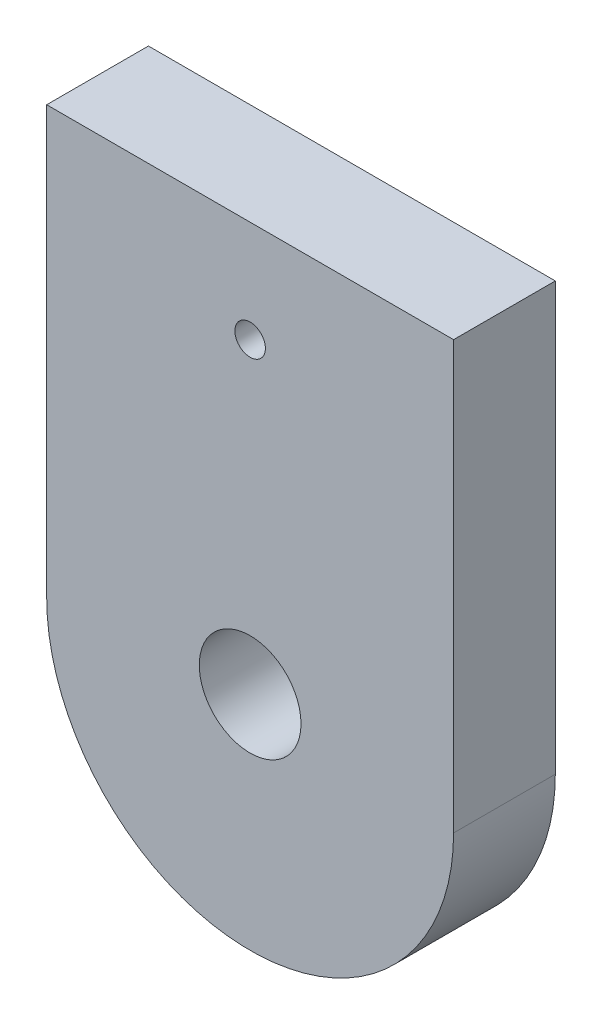
ISO-10303-21;
HEADER;
FILE_DESCRIPTION(('STEP AP214'),'2;1');
FILE_NAME('part.step','',(''),(''),'','','');
FILE_SCHEMA(('AUTOMOTIVE_DESIGN { 1 0 10303 214 1 1 1 1 }'));
ENDSEC;
DATA;
#1=APPLICATION_CONTEXT('core data for automotive mechanical design processes');
#2=APPLICATION_PROTOCOL_DEFINITION('international standard','automotive_design',2000,#1);
#3=PRODUCT_CONTEXT('',#1,'mechanical');
#4=PRODUCT('Part','Part','',(#3));
#5=PRODUCT_RELATED_PRODUCT_CATEGORY('part','',(#4));
#6=PRODUCT_DEFINITION_FORMATION('','',#4);
#7=PRODUCT_DEFINITION_CONTEXT('part definition',#1,'design');
#8=PRODUCT_DEFINITION('design','',#6,#7);
#9=PRODUCT_DEFINITION_SHAPE('','',#8);
#10=(LENGTH_UNIT() NAMED_UNIT(*) SI_UNIT(.MILLI.,.METRE.));
#11=(NAMED_UNIT(*) PLANE_ANGLE_UNIT() SI_UNIT($,.RADIAN.));
#12=(NAMED_UNIT(*) SI_UNIT($,.STERADIAN.) SOLID_ANGLE_UNIT());
#13=UNCERTAINTY_MEASURE_WITH_UNIT(LENGTH_MEASURE(1.E-05),#10,'distance_accuracy_value','');
#14=(GEOMETRIC_REPRESENTATION_CONTEXT(3) GLOBAL_UNCERTAINTY_ASSIGNED_CONTEXT((#13)) GLOBAL_UNIT_ASSIGNED_CONTEXT((#10,
#11,#12)) REPRESENTATION_CONTEXT('',''));
#15=CARTESIAN_POINT('',(0.,0.,0.));
#16=DIRECTION('',(0.,0.,1.));
#17=DIRECTION('',(1.,0.,0.));
#18=AXIS2_PLACEMENT_3D('',#15,#16,#17);
#19=CARTESIAN_POINT('',(0.,-76.7077662842641,10.));
#20=DIRECTION('',(0.,0.,1.));
#21=DIRECTION('',(1.,0.,0.));
#22=AXIS2_PLACEMENT_3D('',#19,#20,#21);
#23=PLANE('',#22);
#24=CARTESIAN_POINT('',(0.,-44.7077662842641,10.));
#25=DIRECTION('',(0.,0.,1.));
#26=DIRECTION('',(1.,0.,0.));
#27=AXIS2_PLACEMENT_3D('',#24,#25,#26);
#28=CIRCLE('',#27,1.5);
#29=CARTESIAN_POINT('',(1.50000000000001,-44.7077662842641,10.));
#30=VERTEX_POINT('',#29);
#31=EDGE_CURVE('E122',#30,#30,#28,.T.);
#32=ORIENTED_EDGE('',*,*,#31,.F.);
#33=EDGE_LOOP('',(#32));
#34=FACE_BOUND('',#33,.T.);
#35=CARTESIAN_POINT('',(0.,-74.9078805598017,10.));
#36=DIRECTION('',(0.,0.,1.));
#37=DIRECTION('',(1.,0.,0.));
#38=AXIS2_PLACEMENT_3D('',#35,#36,#37);
#39=CIRCLE('',#38,5.);
#40=CARTESIAN_POINT('',(5.,-74.9078805598017,10.));
#41=VERTEX_POINT('',#40);
#42=EDGE_CURVE('E132',#41,#41,#39,.F.);
#43=ORIENTED_EDGE('',*,*,#42,.T.);
#44=EDGE_LOOP('',(#43));
#45=FACE_BOUND('',#44,.T.);
#46=DIRECTION('',(-1.,0.,0.));
#47=VECTOR('',#46,1.);
#48=CARTESIAN_POINT('',(-20.,-34.7077662842641,10.));
#49=LINE('',#48,#47);
#50=CARTESIAN_POINT('',(20.,-34.7077662842641,10.));
#51=VERTEX_POINT('',#50);
#52=CARTESIAN_POINT('',(-20.,-34.7077662842641,10.));
#53=VERTEX_POINT('',#52);
#54=EDGE_CURVE('E96',#51,#53,#49,.T.);
#55=ORIENTED_EDGE('',*,*,#54,.T.);
#56=DIRECTION('',(0.,-1.,0.));
#57=VECTOR('',#56,1.);
#58=CARTESIAN_POINT('',(-20.,-76.7077662842641,10.));
#59=LINE('',#58,#57);
#60=CARTESIAN_POINT('',(-20.,-76.7077662842641,10.));
#61=VERTEX_POINT('',#60);
#62=EDGE_CURVE('E62',#53,#61,#59,.T.);
#63=ORIENTED_EDGE('',*,*,#62,.T.);
#64=CARTESIAN_POINT('',(0.,-76.7077662842641,10.));
#65=DIRECTION('',(0.,0.,1.));
#66=DIRECTION('',(1.,0.,0.));
#67=AXIS2_PLACEMENT_3D('',#64,#65,#66);
#68=CIRCLE('',#67,20.);
#69=CARTESIAN_POINT('',(20.,-76.7077662842641,10.));
#70=VERTEX_POINT('',#69);
#71=EDGE_CURVE('E114',#61,#70,#68,.T.);
#72=ORIENTED_EDGE('',*,*,#71,.T.);
#73=DIRECTION('',(0.,1.,0.));
#74=VECTOR('',#73,1.);
#75=CARTESIAN_POINT('',(20.,-34.7077662842641,10.));
#76=LINE('',#75,#74);
#77=EDGE_CURVE('E85',#70,#51,#76,.T.);
#78=ORIENTED_EDGE('',*,*,#77,.T.);
#79=EDGE_LOOP('',(#55,#63,#72,#78));
#80=FACE_BOUND('',#79,.T.);
#81=ADVANCED_FACE('F43',(#34,#45,#80),#23,.T.);
#82=CARTESIAN_POINT('',(0.,-76.7077662842641,0.));
#83=DIRECTION('',(0.,0.,1.));
#84=DIRECTION('',(1.,0.,0.));
#85=AXIS2_PLACEMENT_3D('',#82,#83,#84);
#86=PLANE('',#85);
#87=CARTESIAN_POINT('',(0.,-44.7077662842641,0.));
#88=DIRECTION('',(0.,0.,1.));
#89=DIRECTION('',(1.,0.,0.));
#90=AXIS2_PLACEMENT_3D('',#87,#88,#89);
#91=CIRCLE('',#90,1.5);
#92=CARTESIAN_POINT('',(1.50000000000001,-44.7077662842641,0.));
#93=VERTEX_POINT('',#92);
#94=EDGE_CURVE('E128',#93,#93,#91,.T.);
#95=ORIENTED_EDGE('',*,*,#94,.T.);
#96=EDGE_LOOP('',(#95));
#97=FACE_BOUND('',#96,.T.);
#98=CARTESIAN_POINT('',(0.,-74.9078805598017,0.));
#99=DIRECTION('',(0.,0.,1.));
#100=DIRECTION('',(1.,0.,0.));
#101=AXIS2_PLACEMENT_3D('',#98,#99,#100);
#102=CIRCLE('',#101,5.);
#103=CARTESIAN_POINT('',(5.,-74.9078805598017,0.));
#104=VERTEX_POINT('',#103);
#105=EDGE_CURVE('E47',#104,#104,#102,.F.);
#106=ORIENTED_EDGE('',*,*,#105,.F.);
#107=EDGE_LOOP('',(#106));
#108=FACE_BOUND('',#107,.T.);
#109=DIRECTION('',(0.,-1.,0.));
#110=VECTOR('',#109,1.);
#111=CARTESIAN_POINT('',(-20.,-76.7077662842641,0.));
#112=LINE('',#111,#110);
#113=CARTESIAN_POINT('',(-20.,-34.7077662842641,0.));
#114=VERTEX_POINT('',#113);
#115=CARTESIAN_POINT('',(-20.,-76.7077662842641,0.));
#116=VERTEX_POINT('',#115);
#117=EDGE_CURVE('E82',#114,#116,#112,.T.);
#118=ORIENTED_EDGE('',*,*,#117,.F.);
#119=DIRECTION('',(-1.,0.,0.));
#120=VECTOR('',#119,1.);
#121=CARTESIAN_POINT('',(-20.,-34.7077662842641,0.));
#122=LINE('',#121,#120);
#123=CARTESIAN_POINT('',(20.,-34.7077662842641,0.));
#124=VERTEX_POINT('',#123);
#125=EDGE_CURVE('E104',#124,#114,#122,.T.);
#126=ORIENTED_EDGE('',*,*,#125,.F.);
#127=DIRECTION('',(0.,1.,0.));
#128=VECTOR('',#127,1.);
#129=CARTESIAN_POINT('',(20.,-34.7077662842641,0.));
#130=LINE('',#129,#128);
#131=CARTESIAN_POINT('',(20.,-76.7077662842641,0.));
#132=VERTEX_POINT('',#131);
#133=EDGE_CURVE('E76',#132,#124,#130,.T.);
#134=ORIENTED_EDGE('',*,*,#133,.F.);
#135=CARTESIAN_POINT('',(0.,-76.7077662842641,0.));
#136=DIRECTION('',(0.,0.,1.));
#137=DIRECTION('',(1.,0.,0.));
#138=AXIS2_PLACEMENT_3D('',#135,#136,#137);
#139=CIRCLE('',#138,20.);
#140=EDGE_CURVE('E119',#116,#132,#139,.T.);
#141=ORIENTED_EDGE('',*,*,#140,.F.);
#142=EDGE_LOOP('',(#118,#126,#134,#141));
#143=FACE_BOUND('',#142,.T.);
#144=ADVANCED_FACE('F146',(#97,#108,#143),#86,.F.);
#145=CARTESIAN_POINT('',(0.,-76.7077662842641,10.));
#146=DIRECTION('',(0.,0.,-1.));
#147=DIRECTION('',(-1.,0.,0.));
#148=AXIS2_PLACEMENT_3D('',#145,#146,#147);
#149=CYLINDRICAL_SURFACE('',#148,20.);
#150=ORIENTED_EDGE('',*,*,#140,.T.);
#151=DIRECTION('',(0.,0.,-1.));
#152=VECTOR('',#151,1.);
#153=CARTESIAN_POINT('',(20.,-76.7077662842641,10.));
#154=LINE('',#153,#152);
#155=EDGE_CURVE('E11',#70,#132,#154,.T.);
#156=ORIENTED_EDGE('',*,*,#155,.F.);
#157=ORIENTED_EDGE('',*,*,#71,.F.);
#158=DIRECTION('',(0.,0.,-1.));
#159=VECTOR('',#158,1.);
#160=CARTESIAN_POINT('',(-20.,-76.7077662842641,10.));
#161=LINE('',#160,#159);
#162=EDGE_CURVE('E93',#61,#116,#161,.T.);
#163=ORIENTED_EDGE('',*,*,#162,.T.);
#164=EDGE_LOOP('',(#150,#156,#157,#163));
#165=FACE_BOUND('',#164,.T.);
#166=ADVANCED_FACE('F45',(#165),#149,.T.);
#167=CARTESIAN_POINT('',(20.,-34.7077662842641,10.));
#168=DIRECTION('',(-1.,0.,0.));
#169=DIRECTION('',(0.,-1.,0.));
#170=AXIS2_PLACEMENT_3D('',#167,#168,#169);
#171=PLANE('',#170);
#172=ORIENTED_EDGE('',*,*,#133,.T.);
#173=DIRECTION('',(0.,0.,-1.));
#174=VECTOR('',#173,1.);
#175=CARTESIAN_POINT('',(20.,-34.7077662842641,10.));
#176=LINE('',#175,#174);
#177=EDGE_CURVE('E54',#51,#124,#176,.T.);
#178=ORIENTED_EDGE('',*,*,#177,.F.);
#179=ORIENTED_EDGE('',*,*,#77,.F.);
#180=ORIENTED_EDGE('',*,*,#155,.T.);
#181=EDGE_LOOP('',(#172,#178,#179,#180));
#182=FACE_BOUND('',#181,.T.);
#183=ADVANCED_FACE('F154',(#182),#171,.F.);
#184=CARTESIAN_POINT('',(-20.,-34.7077662842641,10.));
#185=DIRECTION('',(0.,-1.,0.));
#186=DIRECTION('',(0.,0.,-1.));
#187=AXIS2_PLACEMENT_3D('',#184,#185,#186);
#188=PLANE('',#187);
#189=ORIENTED_EDGE('',*,*,#125,.T.);
#190=DIRECTION('',(0.,0.,-1.));
#191=VECTOR('',#190,1.);
#192=CARTESIAN_POINT('',(-20.,-34.7077662842641,10.));
#193=LINE('',#192,#191);
#194=EDGE_CURVE('E91',#53,#114,#193,.T.);
#195=ORIENTED_EDGE('',*,*,#194,.F.);
#196=ORIENTED_EDGE('',*,*,#54,.F.);
#197=ORIENTED_EDGE('',*,*,#177,.T.);
#198=EDGE_LOOP('',(#189,#195,#196,#197));
#199=FACE_BOUND('',#198,.T.);
#200=ADVANCED_FACE('F102',(#199),#188,.F.);
#201=CARTESIAN_POINT('',(-20.,-76.7077662842641,10.));
#202=DIRECTION('',(1.,0.,0.));
#203=DIRECTION('',(0.,1.,0.));
#204=AXIS2_PLACEMENT_3D('',#201,#202,#203);
#205=PLANE('',#204);
#206=ORIENTED_EDGE('',*,*,#117,.T.);
#207=ORIENTED_EDGE('',*,*,#162,.F.);
#208=ORIENTED_EDGE('',*,*,#62,.F.);
#209=ORIENTED_EDGE('',*,*,#194,.T.);
#210=EDGE_LOOP('',(#206,#207,#208,#209));
#211=FACE_BOUND('',#210,.T.);
#212=ADVANCED_FACE('F89',(#211),#205,.F.);
#213=CARTESIAN_POINT('',(0.,-44.7077662842641,10.));
#214=DIRECTION('',(0.,0.,-1.));
#215=DIRECTION('',(-1.,0.,0.));
#216=AXIS2_PLACEMENT_3D('',#213,#214,#215);
#217=CYLINDRICAL_SURFACE('',#216,1.5);
#218=ORIENTED_EDGE('',*,*,#31,.T.);
#219=EDGE_LOOP('',(#218));
#220=FACE_BOUND('',#219,.T.);
#221=ORIENTED_EDGE('',*,*,#94,.F.);
#222=EDGE_LOOP('',(#221));
#223=FACE_BOUND('',#222,.T.);
#224=ADVANCED_FACE('F168',(#220,#223),#217,.F.);
#225=CARTESIAN_POINT('',(0.,-74.9078805598017,47.));
#226=DIRECTION('',(0.,0.,-1.));
#227=DIRECTION('',(-1.,0.,0.));
#228=AXIS2_PLACEMENT_3D('',#225,#226,#227);
#229=CYLINDRICAL_SURFACE('',#228,5.);
#230=ORIENTED_EDGE('',*,*,#42,.F.);
#231=EDGE_LOOP('',(#230));
#232=FACE_BOUND('',#231,.T.);
#233=ORIENTED_EDGE('',*,*,#105,.T.);
#234=EDGE_LOOP('',(#233));
#235=FACE_BOUND('',#234,.T.);
#236=ADVANCED_FACE('F144',(#232,#235),#229,.F.);
#237=CLOSED_SHELL('',(#81,#144,#166,#183,#200,#212,#224,#236));
#238=MANIFOLD_SOLID_BREP('B2',#237);
#239=ADVANCED_BREP_SHAPE_REPRESENTATION('',(#18,#238),#14);
#240=SHAPE_DEFINITION_REPRESENTATION(#9,#239);
ENDSEC;
END-ISO-10303-21;
